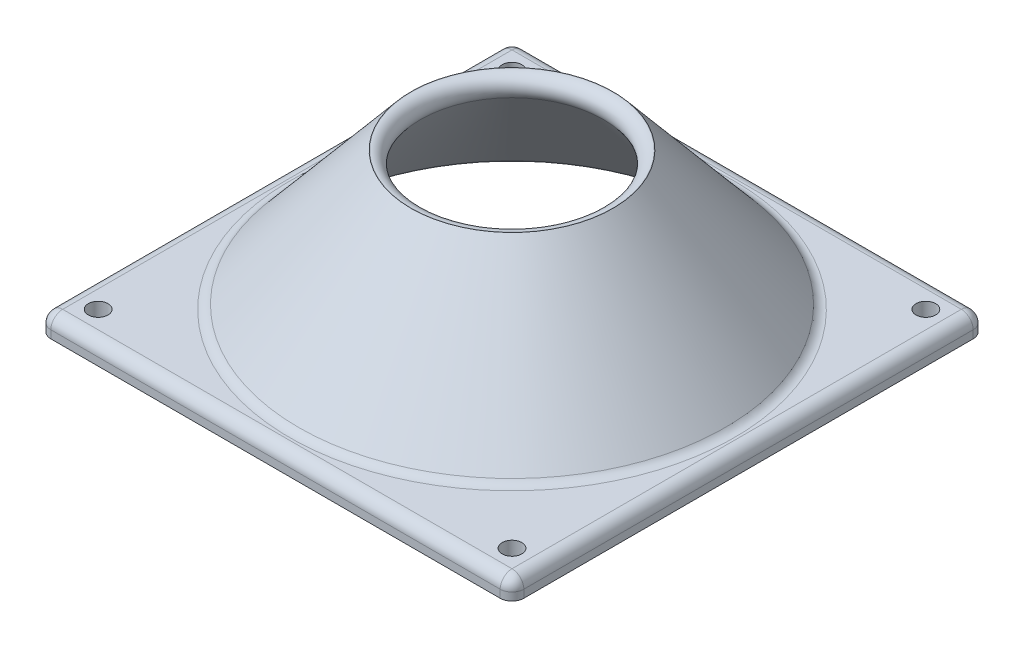
ISO-10303-21;
HEADER;
FILE_DESCRIPTION(('STEP AP214'),'2;1');
FILE_NAME('part.step','',(''),(''),'','','');
FILE_SCHEMA(('AUTOMOTIVE_DESIGN { 1 0 10303 214 1 1 1 1 }'));
ENDSEC;
DATA;
#1=APPLICATION_CONTEXT('core data for automotive mechanical design processes');
#2=APPLICATION_PROTOCOL_DEFINITION('international standard','automotive_design',2000,#1);
#3=PRODUCT_CONTEXT('',#1,'mechanical');
#4=PRODUCT('Part','Part','',(#3));
#5=PRODUCT_RELATED_PRODUCT_CATEGORY('part','',(#4));
#6=PRODUCT_DEFINITION_FORMATION('','',#4);
#7=PRODUCT_DEFINITION_CONTEXT('part definition',#1,'design');
#8=PRODUCT_DEFINITION('design','',#6,#7);
#9=PRODUCT_DEFINITION_SHAPE('','',#8);
#10=(LENGTH_UNIT() NAMED_UNIT(*) SI_UNIT(.MILLI.,.METRE.));
#11=(NAMED_UNIT(*) PLANE_ANGLE_UNIT() SI_UNIT($,.RADIAN.));
#12=(NAMED_UNIT(*) SI_UNIT($,.STERADIAN.) SOLID_ANGLE_UNIT());
#13=UNCERTAINTY_MEASURE_WITH_UNIT(LENGTH_MEASURE(1.E-05),#10,'distance_accuracy_value','');
#14=(GEOMETRIC_REPRESENTATION_CONTEXT(3) GLOBAL_UNCERTAINTY_ASSIGNED_CONTEXT((#13)) GLOBAL_UNIT_ASSIGNED_CONTEXT((#10,
#11,#12)) REPRESENTATION_CONTEXT('',''));
#15=CARTESIAN_POINT('',(0.,0.,0.));
#16=DIRECTION('',(0.,0.,1.));
#17=DIRECTION('',(1.,0.,0.));
#18=AXIS2_PLACEMENT_3D('',#15,#16,#17);
#19=CARTESIAN_POINT('',(0.,5.,0.));
#20=DIRECTION('',(0.,-1.,0.));
#21=DIRECTION('',(0.,0.,-1.));
#22=AXIS2_PLACEMENT_3D('',#19,#20,#21);
#23=PLANE('',#22);
#24=DIRECTION('',(1.,0.,0.));
#25=VECTOR('',#24,1.);
#26=CARTESIAN_POINT('',(0.,5.,57.));
#27=LINE('',#26,#25);
#28=CARTESIAN_POINT('',(-57.,5.,57.));
#29=VERTEX_POINT('',#28);
#30=CARTESIAN_POINT('',(57.,5.,57.));
#31=VERTEX_POINT('',#30);
#32=EDGE_CURVE('E144',#29,#31,#27,.T.);
#33=ORIENTED_EDGE('',*,*,#32,.T.);
#34=DIRECTION('',(0.,0.,-1.));
#35=VECTOR('',#34,1.);
#36=CARTESIAN_POINT('',(57.,5.,0.));
#37=LINE('',#36,#35);
#38=CARTESIAN_POINT('',(57.,5.,-57.));
#39=VERTEX_POINT('',#38);
#40=EDGE_CURVE('E116',#31,#39,#37,.T.);
#41=ORIENTED_EDGE('',*,*,#40,.T.);
#42=DIRECTION('',(-1.,0.,0.));
#43=VECTOR('',#42,1.);
#44=CARTESIAN_POINT('',(0.,5.,-57.));
#45=LINE('',#44,#43);
#46=CARTESIAN_POINT('',(-57.,5.,-57.));
#47=VERTEX_POINT('',#46);
#48=EDGE_CURVE('E133',#39,#47,#45,.T.);
#49=ORIENTED_EDGE('',*,*,#48,.T.);
#50=DIRECTION('',(0.,0.,1.));
#51=VECTOR('',#50,1.);
#52=CARTESIAN_POINT('',(-57.,5.,0.));
#53=LINE('',#52,#51);
#54=EDGE_CURVE('E139',#47,#29,#53,.T.);
#55=ORIENTED_EDGE('',*,*,#54,.T.);
#56=EDGE_LOOP('',(#33,#41,#49,#55));
#57=FACE_BOUND('',#56,.T.);
#58=CARTESIAN_POINT('',(0.,5.,0.));
#59=DIRECTION('',(0.,-1.,0.));
#60=DIRECTION('',(0.,0.,-1.));
#61=AXIS2_PLACEMENT_3D('',#58,#59,#60);
#62=CIRCLE('',#61,56.398922974465);
#63=CARTESIAN_POINT('',(0.,5.,-56.398922974465));
#64=VERTEX_POINT('',#63);
#65=EDGE_CURVE('E249',#64,#64,#62,.T.);
#66=ORIENTED_EDGE('',*,*,#65,.T.);
#67=EDGE_LOOP('',(#66));
#68=FACE_BOUND('',#67,.T.);
#69=CARTESIAN_POINT('',(-52.5,5.,-52.5));
#70=DIRECTION('',(0.,1.,0.));
#71=DIRECTION('',(0.,0.,1.));
#72=AXIS2_PLACEMENT_3D('',#69,#70,#71);
#73=CIRCLE('',#72,2.5);
#74=CARTESIAN_POINT('',(-52.5,5.,-50.));
#75=VERTEX_POINT('',#74);
#76=EDGE_CURVE('E224',#75,#75,#73,.T.);
#77=ORIENTED_EDGE('',*,*,#76,.F.);
#78=EDGE_LOOP('',(#77));
#79=FACE_BOUND('',#78,.T.);
#80=CARTESIAN_POINT('',(52.5,5.,-52.5000000000029));
#81=DIRECTION('',(0.,1.,0.));
#82=DIRECTION('',(0.,0.,1.));
#83=AXIS2_PLACEMENT_3D('',#80,#81,#82);
#84=CIRCLE('',#83,2.50000000000305);
#85=CARTESIAN_POINT('',(52.5,5.,-49.9999999999999));
#86=VERTEX_POINT('',#85);
#87=EDGE_CURVE('E218',#86,#86,#84,.T.);
#88=ORIENTED_EDGE('',*,*,#87,.F.);
#89=EDGE_LOOP('',(#88));
#90=FACE_BOUND('',#89,.T.);
#91=CARTESIAN_POINT('',(52.5000000000029,5.,52.499999999997));
#92=DIRECTION('',(0.,1.,0.));
#93=DIRECTION('',(0.,0.,1.));
#94=AXIS2_PLACEMENT_3D('',#91,#92,#93);
#95=CIRCLE('',#94,2.50000000000414);
#96=CARTESIAN_POINT('',(52.5000000000029,5.,55.0000000000012));
#97=VERTEX_POINT('',#96);
#98=EDGE_CURVE('E212',#97,#97,#95,.T.);
#99=ORIENTED_EDGE('',*,*,#98,.F.);
#100=EDGE_LOOP('',(#99));
#101=FACE_BOUND('',#100,.T.);
#102=CARTESIAN_POINT('',(-52.499999999997,5.,52.5));
#103=DIRECTION('',(0.,1.,0.));
#104=DIRECTION('',(0.,0.,1.));
#105=AXIS2_PLACEMENT_3D('',#102,#103,#104);
#106=CIRCLE('',#105,2.50000000000155);
#107=CARTESIAN_POINT('',(-52.499999999997,5.,55.0000000000015));
#108=VERTEX_POINT('',#107);
#109=EDGE_CURVE('E206',#108,#108,#106,.T.);
#110=ORIENTED_EDGE('',*,*,#109,.F.);
#111=EDGE_LOOP('',(#110));
#112=FACE_BOUND('',#111,.T.);
#113=ADVANCED_FACE('F33',(#57,#68,#79,#90,#101,#112),#23,.F.);
#114=CARTESIAN_POINT('',(0.,0.,0.));
#115=DIRECTION('',(0.,-1.,0.));
#116=DIRECTION('',(0.,0.,-1.));
#117=AXIS2_PLACEMENT_3D('',#114,#115,#116);
#118=PLANE('',#117);
#119=CARTESIAN_POINT('',(0.,0.,0.));
#120=DIRECTION('',(0.,-1.,0.));
#121=DIRECTION('',(0.,0.,-1.));
#122=AXIS2_PLACEMENT_3D('',#119,#120,#121);
#123=CIRCLE('',#122,54.06738468369);
#124=CARTESIAN_POINT('',(0.,0.,-54.06738468369));
#125=VERTEX_POINT('',#124);
#126=EDGE_CURVE('E252',#125,#125,#123,.F.);
#127=ORIENTED_EDGE('',*,*,#126,.T.);
#128=EDGE_LOOP('',(#127));
#129=FACE_BOUND('',#128,.T.);
#130=CARTESIAN_POINT('',(52.5000000000029,0.,52.499999999997));
#131=DIRECTION('',(0.,1.,0.));
#132=DIRECTION('',(0.,0.,1.));
#133=AXIS2_PLACEMENT_3D('',#130,#131,#132);
#134=CIRCLE('',#133,2.50000000000414);
#135=CARTESIAN_POINT('',(52.5000000000029,0.,55.0000000000012));
#136=VERTEX_POINT('',#135);
#137=EDGE_CURVE('E210',#136,#136,#134,.T.);
#138=ORIENTED_EDGE('',*,*,#137,.T.);
#139=EDGE_LOOP('',(#138));
#140=FACE_BOUND('',#139,.T.);
#141=CARTESIAN_POINT('',(-52.5,0.,-52.5));
#142=DIRECTION('',(0.,1.,0.));
#143=DIRECTION('',(0.,0.,1.));
#144=AXIS2_PLACEMENT_3D('',#141,#142,#143);
#145=CIRCLE('',#144,2.5);
#146=CARTESIAN_POINT('',(-52.5,0.,-50.));
#147=VERTEX_POINT('',#146);
#148=EDGE_CURVE('E221',#147,#147,#145,.T.);
#149=ORIENTED_EDGE('',*,*,#148,.T.);
#150=EDGE_LOOP('',(#149));
#151=FACE_BOUND('',#150,.T.);
#152=DIRECTION('',(0.,0.,-1.));
#153=VECTOR('',#152,1.);
#154=CARTESIAN_POINT('',(60.,0.,60.));
#155=LINE('',#154,#153);
#156=CARTESIAN_POINT('',(60.,0.,57.));
#157=VERTEX_POINT('',#156);
#158=CARTESIAN_POINT('',(60.,0.,-57.));
#159=VERTEX_POINT('',#158);
#160=EDGE_CURVE('E227',#157,#159,#155,.T.);
#161=ORIENTED_EDGE('',*,*,#160,.F.);
#162=CARTESIAN_POINT('',(57.,0.,57.));
#163=DIRECTION('',(0.,-1.,0.));
#164=DIRECTION('',(0.,0.,-1.));
#165=AXIS2_PLACEMENT_3D('',#162,#163,#164);
#166=CIRCLE('',#165,3.);
#167=CARTESIAN_POINT('',(57.,0.,60.));
#168=VERTEX_POINT('',#167);
#169=EDGE_CURVE('E11',#157,#168,#166,.T.);
#170=ORIENTED_EDGE('',*,*,#169,.T.);
#171=DIRECTION('',(1.,0.,0.));
#172=VECTOR('',#171,1.);
#173=CARTESIAN_POINT('',(-60.,0.,60.));
#174=LINE('',#173,#172);
#175=CARTESIAN_POINT('',(-57.,0.,60.));
#176=VERTEX_POINT('',#175);
#177=EDGE_CURVE('E237',#176,#168,#174,.T.);
#178=ORIENTED_EDGE('',*,*,#177,.F.);
#179=CARTESIAN_POINT('',(-57.,0.,57.));
#180=DIRECTION('',(0.,-1.,0.));
#181=DIRECTION('',(0.,0.,-1.));
#182=AXIS2_PLACEMENT_3D('',#179,#180,#181);
#183=CIRCLE('',#182,3.);
#184=CARTESIAN_POINT('',(-60.,0.,57.));
#185=VERTEX_POINT('',#184);
#186=EDGE_CURVE('E171',#176,#185,#183,.T.);
#187=ORIENTED_EDGE('',*,*,#186,.T.);
#188=DIRECTION('',(0.,0.,1.));
#189=VECTOR('',#188,1.);
#190=CARTESIAN_POINT('',(-60.,0.,60.));
#191=LINE('',#190,#189);
#192=CARTESIAN_POINT('',(-60.,0.,-57.));
#193=VERTEX_POINT('',#192);
#194=EDGE_CURVE('E234',#193,#185,#191,.T.);
#195=ORIENTED_EDGE('',*,*,#194,.F.);
#196=CARTESIAN_POINT('',(-57.,0.,-57.));
#197=DIRECTION('',(0.,-1.,0.));
#198=DIRECTION('',(0.,0.,-1.));
#199=AXIS2_PLACEMENT_3D('',#196,#197,#198);
#200=CIRCLE('',#199,3.);
#201=CARTESIAN_POINT('',(-57.,0.,-60.));
#202=VERTEX_POINT('',#201);
#203=EDGE_CURVE('E173',#193,#202,#200,.T.);
#204=ORIENTED_EDGE('',*,*,#203,.T.);
#205=DIRECTION('',(-1.,0.,0.));
#206=VECTOR('',#205,1.);
#207=CARTESIAN_POINT('',(-60.,0.,-60.));
#208=LINE('',#207,#206);
#209=CARTESIAN_POINT('',(57.,0.,-60.));
#210=VERTEX_POINT('',#209);
#211=EDGE_CURVE('E232',#210,#202,#208,.T.);
#212=ORIENTED_EDGE('',*,*,#211,.F.);
#213=CARTESIAN_POINT('',(57.,0.,-57.));
#214=DIRECTION('',(0.,-1.,0.));
#215=DIRECTION('',(0.,0.,-1.));
#216=AXIS2_PLACEMENT_3D('',#213,#214,#215);
#217=CIRCLE('',#216,3.);
#218=EDGE_CURVE('E42',#210,#159,#217,.T.);
#219=ORIENTED_EDGE('',*,*,#218,.T.);
#220=EDGE_LOOP('',(#161,#170,#178,#187,#195,#204,#212,#219));
#221=FACE_BOUND('',#220,.T.);
#222=CARTESIAN_POINT('',(52.5,0.,-52.5000000000029));
#223=DIRECTION('',(0.,1.,0.));
#224=DIRECTION('',(0.,0.,1.));
#225=AXIS2_PLACEMENT_3D('',#222,#223,#224);
#226=CIRCLE('',#225,2.50000000000305);
#227=CARTESIAN_POINT('',(52.5,0.,-49.9999999999999));
#228=VERTEX_POINT('',#227);
#229=EDGE_CURVE('E215',#228,#228,#226,.T.);
#230=ORIENTED_EDGE('',*,*,#229,.T.);
#231=EDGE_LOOP('',(#230));
#232=FACE_BOUND('',#231,.T.);
#233=CARTESIAN_POINT('',(-52.499999999997,0.,52.5));
#234=DIRECTION('',(0.,1.,0.));
#235=DIRECTION('',(0.,0.,1.));
#236=AXIS2_PLACEMENT_3D('',#233,#234,#235);
#237=CIRCLE('',#236,2.50000000000155);
#238=CARTESIAN_POINT('',(-52.499999999997,0.,55.0000000000015));
#239=VERTEX_POINT('',#238);
#240=EDGE_CURVE('E201',#239,#239,#237,.T.);
#241=ORIENTED_EDGE('',*,*,#240,.T.);
#242=EDGE_LOOP('',(#241));
#243=FACE_BOUND('',#242,.T.);
#244=ADVANCED_FACE('F283',(#129,#140,#151,#221,#232,#243),#118,.T.);
#245=CARTESIAN_POINT('',(60.,5.,60.));
#246=DIRECTION('',(-1.,0.,0.));
#247=DIRECTION('',(0.,0.,1.));
#248=AXIS2_PLACEMENT_3D('',#245,#246,#247);
#249=PLANE('',#248);
#250=DIRECTION('',(0.,0.,-1.));
#251=VECTOR('',#250,1.);
#252=CARTESIAN_POINT('',(60.,2.,60.));
#253=LINE('',#252,#251);
#254=CARTESIAN_POINT('',(60.,2.,-57.));
#255=VERTEX_POINT('',#254);
#256=CARTESIAN_POINT('',(60.,2.,57.));
#257=VERTEX_POINT('',#256);
#258=EDGE_CURVE('E118',#255,#257,#253,.F.);
#259=ORIENTED_EDGE('',*,*,#258,.T.);
#260=DIRECTION('',(0.,-1.,0.));
#261=VECTOR('',#260,1.);
#262=CARTESIAN_POINT('',(60.,5.,57.));
#263=LINE('',#262,#261);
#264=EDGE_CURVE('E153',#257,#157,#263,.T.);
#265=ORIENTED_EDGE('',*,*,#264,.T.);
#266=ORIENTED_EDGE('',*,*,#160,.T.);
#267=DIRECTION('',(0.,-1.,0.));
#268=VECTOR('',#267,1.);
#269=CARTESIAN_POINT('',(60.,5.,-57.));
#270=LINE('',#269,#268);
#271=EDGE_CURVE('E146',#159,#255,#270,.F.);
#272=ORIENTED_EDGE('',*,*,#271,.T.);
#273=EDGE_LOOP('',(#259,#265,#266,#272));
#274=FACE_BOUND('',#273,.T.);
#275=ADVANCED_FACE('F275',(#274),#249,.F.);
#276=CARTESIAN_POINT('',(-60.,5.,-60.));
#277=DIRECTION('',(0.,0.,1.));
#278=DIRECTION('',(1.,0.,0.));
#279=AXIS2_PLACEMENT_3D('',#276,#277,#278);
#280=PLANE('',#279);
#281=DIRECTION('',(-1.,0.,0.));
#282=VECTOR('',#281,1.);
#283=CARTESIAN_POINT('',(-60.,2.,-60.));
#284=LINE('',#283,#282);
#285=CARTESIAN_POINT('',(-57.,2.,-60.));
#286=VERTEX_POINT('',#285);
#287=CARTESIAN_POINT('',(57.,2.,-60.));
#288=VERTEX_POINT('',#287);
#289=EDGE_CURVE('E50',#286,#288,#284,.F.);
#290=ORIENTED_EDGE('',*,*,#289,.T.);
#291=DIRECTION('',(0.,-1.,0.));
#292=VECTOR('',#291,1.);
#293=CARTESIAN_POINT('',(57.,5.,-60.));
#294=LINE('',#293,#292);
#295=EDGE_CURVE('E169',#288,#210,#294,.T.);
#296=ORIENTED_EDGE('',*,*,#295,.T.);
#297=ORIENTED_EDGE('',*,*,#211,.T.);
#298=DIRECTION('',(0.,-1.,0.));
#299=VECTOR('',#298,1.);
#300=CARTESIAN_POINT('',(-57.,5.,-60.));
#301=LINE('',#300,#299);
#302=EDGE_CURVE('E55',#202,#286,#301,.F.);
#303=ORIENTED_EDGE('',*,*,#302,.T.);
#304=EDGE_LOOP('',(#290,#296,#297,#303));
#305=FACE_BOUND('',#304,.T.);
#306=ADVANCED_FACE('F281',(#305),#280,.F.);
#307=CARTESIAN_POINT('',(-60.,5.,60.));
#308=DIRECTION('',(1.,0.,0.));
#309=DIRECTION('',(0.,0.,-1.));
#310=AXIS2_PLACEMENT_3D('',#307,#308,#309);
#311=PLANE('',#310);
#312=DIRECTION('',(0.,0.,1.));
#313=VECTOR('',#312,1.);
#314=CARTESIAN_POINT('',(-60.,2.,60.));
#315=LINE('',#314,#313);
#316=CARTESIAN_POINT('',(-60.,2.,57.));
#317=VERTEX_POINT('',#316);
#318=CARTESIAN_POINT('',(-60.,2.,-57.));
#319=VERTEX_POINT('',#318);
#320=EDGE_CURVE('E163',#317,#319,#315,.F.);
#321=ORIENTED_EDGE('',*,*,#320,.T.);
#322=DIRECTION('',(0.,-1.,0.));
#323=VECTOR('',#322,1.);
#324=CARTESIAN_POINT('',(-60.,5.,-57.));
#325=LINE('',#324,#323);
#326=EDGE_CURVE('E165',#319,#193,#325,.T.);
#327=ORIENTED_EDGE('',*,*,#326,.T.);
#328=ORIENTED_EDGE('',*,*,#194,.T.);
#329=DIRECTION('',(0.,-1.,0.));
#330=VECTOR('',#329,1.);
#331=CARTESIAN_POINT('',(-60.,5.,57.));
#332=LINE('',#331,#330);
#333=EDGE_CURVE('E161',#185,#317,#332,.F.);
#334=ORIENTED_EDGE('',*,*,#333,.T.);
#335=EDGE_LOOP('',(#321,#327,#328,#334));
#336=FACE_BOUND('',#335,.T.);
#337=ADVANCED_FACE('F314',(#336),#311,.F.);
#338=CARTESIAN_POINT('',(-60.,5.,60.));
#339=DIRECTION('',(0.,0.,-1.));
#340=DIRECTION('',(-1.,0.,0.));
#341=AXIS2_PLACEMENT_3D('',#338,#339,#340);
#342=PLANE('',#341);
#343=ORIENTED_EDGE('',*,*,#177,.T.);
#344=DIRECTION('',(0.,-1.,0.));
#345=VECTOR('',#344,1.);
#346=CARTESIAN_POINT('',(57.,5.,60.));
#347=LINE('',#346,#345);
#348=CARTESIAN_POINT('',(57.,2.,60.));
#349=VERTEX_POINT('',#348);
#350=EDGE_CURVE('E159',#168,#349,#347,.F.);
#351=ORIENTED_EDGE('',*,*,#350,.T.);
#352=DIRECTION('',(1.,0.,0.));
#353=VECTOR('',#352,1.);
#354=CARTESIAN_POINT('',(-60.,2.,60.));
#355=LINE('',#354,#353);
#356=CARTESIAN_POINT('',(-57.,2.,60.));
#357=VERTEX_POINT('',#356);
#358=EDGE_CURVE('E157',#349,#357,#355,.F.);
#359=ORIENTED_EDGE('',*,*,#358,.T.);
#360=DIRECTION('',(0.,-1.,0.));
#361=VECTOR('',#360,1.);
#362=CARTESIAN_POINT('',(-57.,5.,60.));
#363=LINE('',#362,#361);
#364=EDGE_CURVE('E155',#357,#176,#363,.T.);
#365=ORIENTED_EDGE('',*,*,#364,.T.);
#366=EDGE_LOOP('',(#343,#351,#359,#365));
#367=FACE_BOUND('',#366,.T.);
#368=ADVANCED_FACE('F311',(#367),#342,.F.);
#369=CARTESIAN_POINT('',(-52.5,5.,-52.5));
#370=DIRECTION('',(0.,-1.,0.));
#371=DIRECTION('',(0.,0.,-1.));
#372=AXIS2_PLACEMENT_3D('',#369,#370,#371);
#373=CYLINDRICAL_SURFACE('',#372,2.5);
#374=ORIENTED_EDGE('',*,*,#76,.T.);
#375=EDGE_LOOP('',(#374));
#376=FACE_BOUND('',#375,.T.);
#377=ORIENTED_EDGE('',*,*,#148,.F.);
#378=EDGE_LOOP('',(#377));
#379=FACE_BOUND('',#378,.T.);
#380=ADVANCED_FACE('F308',(#376,#379),#373,.F.);
#381=CARTESIAN_POINT('',(52.5,5.,-52.5000000000029));
#382=DIRECTION('',(0.,-1.,0.));
#383=DIRECTION('',(0.,0.,-1.));
#384=AXIS2_PLACEMENT_3D('',#381,#382,#383);
#385=CYLINDRICAL_SURFACE('',#384,2.50000000000305);
#386=ORIENTED_EDGE('',*,*,#87,.T.);
#387=EDGE_LOOP('',(#386));
#388=FACE_BOUND('',#387,.T.);
#389=ORIENTED_EDGE('',*,*,#229,.F.);
#390=EDGE_LOOP('',(#389));
#391=FACE_BOUND('',#390,.T.);
#392=ADVANCED_FACE('F476',(#388,#391),#385,.F.);
#393=CARTESIAN_POINT('',(52.5000000000029,5.,52.499999999997));
#394=DIRECTION('',(0.,-1.,0.));
#395=DIRECTION('',(0.,0.,-1.));
#396=AXIS2_PLACEMENT_3D('',#393,#394,#395);
#397=CYLINDRICAL_SURFACE('',#396,2.50000000000414);
#398=ORIENTED_EDGE('',*,*,#98,.T.);
#399=EDGE_LOOP('',(#398));
#400=FACE_BOUND('',#399,.T.);
#401=ORIENTED_EDGE('',*,*,#137,.F.);
#402=EDGE_LOOP('',(#401));
#403=FACE_BOUND('',#402,.T.);
#404=ADVANCED_FACE('F467',(#400,#403),#397,.F.);
#405=CARTESIAN_POINT('',(-52.499999999997,5.,52.5));
#406=DIRECTION('',(0.,-1.,0.));
#407=DIRECTION('',(0.,0.,-1.));
#408=AXIS2_PLACEMENT_3D('',#405,#406,#407);
#409=CYLINDRICAL_SURFACE('',#408,2.50000000000155);
#410=ORIENTED_EDGE('',*,*,#109,.T.);
#411=EDGE_LOOP('',(#410));
#412=FACE_BOUND('',#411,.T.);
#413=ORIENTED_EDGE('',*,*,#240,.F.);
#414=EDGE_LOOP('',(#413));
#415=FACE_BOUND('',#414,.T.);
#416=ADVANCED_FACE('F458',(#412,#415),#409,.F.);
#417=CARTESIAN_POINT('',(0.,5.,0.));
#418=DIRECTION('',(0.,-1.,0.));
#419=DIRECTION('',(0.,0.,1.));
#420=AXIS2_PLACEMENT_3D('',#417,#418,#419);
#421=CONICAL_SURFACE('',#420,55.,0.698131700797733);
#422=CARTESIAN_POINT('',(0.,6.07163717094038,0.));
#423=DIRECTION('',(0.,-1.,0.));
#424=DIRECTION('',(0.,0.,-1.));
#425=AXIS2_PLACEMENT_3D('',#422,#423,#424);
#426=CIRCLE('',#425,54.1007896451081);
#427=CARTESIAN_POINT('',(0.,6.07163717094038,-54.1007896451081));
#428=VERTEX_POINT('',#427);
#429=EDGE_CURVE('E246',#428,#428,#426,.F.);
#430=ORIENTED_EDGE('',*,*,#429,.T.);
#431=EDGE_LOOP('',(#430));
#432=FACE_BOUND('',#431,.T.);
#433=CARTESIAN_POINT('',(0.,40.,0.));
#434=DIRECTION('',(0.,1.,0.));
#435=DIRECTION('',(0.,0.,1.));
#436=AXIS2_PLACEMENT_3D('',#433,#434,#435);
#437=CIRCLE('',#436,25.6315129087951);
#438=CARTESIAN_POINT('',(0.,40.,25.6315129087951));
#439=VERTEX_POINT('',#438);
#440=EDGE_CURVE('E198',#439,#439,#437,.T.);
#441=ORIENTED_EDGE('',*,*,#440,.F.);
#442=EDGE_LOOP('',(#441));
#443=FACE_BOUND('',#442,.T.);
#444=ADVANCED_FACE('F449',(#432,#443),#421,.T.);
#445=CARTESIAN_POINT('',(0.,40.,0.));
#446=DIRECTION('',(0.,1.,0.));
#447=DIRECTION('',(0.,0.,1.));
#448=AXIS2_PLACEMENT_3D('',#445,#446,#447);
#449=PLANE('',#448);
#450=CARTESIAN_POINT('',(0.,40.,0.));
#451=DIRECTION('',(0.,1.,0.));
#452=DIRECTION('',(0.,0.,1.));
#453=AXIS2_PLACEMENT_3D('',#450,#451,#452);
#454=CIRCLE('',#453,25.5379972236624);
#455=CARTESIAN_POINT('',(0.,40.,25.5379972236624));
#456=VERTEX_POINT('',#455);
#457=EDGE_CURVE('E243',#456,#456,#454,.F.);
#458=ORIENTED_EDGE('',*,*,#457,.T.);
#459=EDGE_LOOP('',(#458));
#460=FACE_BOUND('',#459,.T.);
#461=ORIENTED_EDGE('',*,*,#440,.T.);
#462=EDGE_LOOP('',(#461));
#463=FACE_BOUND('',#462,.T.);
#464=ADVANCED_FACE('F441',(#460,#463),#449,.T.);
#465=CARTESIAN_POINT('',(0.,1.7860619515673,0.));
#466=DIRECTION('',(0.,-1.,0.));
#467=DIRECTION('',(0.,0.,1.));
#468=AXIS2_PLACEMENT_3D('',#465,#466,#467);
#469=CONICAL_SURFACE('',#468,51.1697777844051,0.698131700797733);
#470=CARTESIAN_POINT('',(0.,1.07163717094038,0.));
#471=DIRECTION('',(0.,1.,0.));
#472=DIRECTION('',(0.,0.,1.));
#473=AXIS2_PLACEMENT_3D('',#470,#471,#472);
#474=CIRCLE('',#473,51.7692513543331);
#475=CARTESIAN_POINT('',(0.,1.07163717094038,51.7692513543331));
#476=VERTEX_POINT('',#475);
#477=EDGE_CURVE('E140',#476,#476,#474,.F.);
#478=ORIENTED_EDGE('',*,*,#477,.T.);
#479=EDGE_LOOP('',(#478));
#480=FACE_BOUND('',#479,.T.);
#481=CARTESIAN_POINT('',(0.,35.0716371709404,0.));
#482=DIRECTION('',(0.,1.,0.));
#483=DIRECTION('',(0.,0.,1.));
#484=AXIS2_PLACEMENT_3D('',#481,#482,#483);
#485=CIRCLE('',#484,23.2398638943055);
#486=CARTESIAN_POINT('',(0.,35.0716371709404,23.2398638943055));
#487=VERTEX_POINT('',#486);
#488=EDGE_CURVE('E240',#487,#487,#485,.T.);
#489=ORIENTED_EDGE('',*,*,#488,.T.);
#490=EDGE_LOOP('',(#489));
#491=FACE_BOUND('',#490,.T.);
#492=ADVANCED_FACE('F327',(#480,#491),#469,.F.);
#493=CARTESIAN_POINT('',(0.,37.,0.));
#494=DIRECTION('',(0.,1.,0.));
#495=DIRECTION('',(0.,0.,1.));
#496=AXIS2_PLACEMENT_3D('',#493,#494,#495);
#497=TOROIDAL_SURFACE('',#496,25.5379972236624,3.);
#498=ORIENTED_EDGE('',*,*,#457,.F.);
#499=EDGE_LOOP('',(#498));
#500=FACE_BOUND('',#499,.T.);
#501=ORIENTED_EDGE('',*,*,#488,.F.);
#502=EDGE_LOOP('',(#501));
#503=FACE_BOUND('',#502,.T.);
#504=ADVANCED_FACE('F323',(#500,#503),#497,.T.);
#505=CARTESIAN_POINT('',(0.,8.,0.));
#506=DIRECTION('',(0.,-1.,0.));
#507=DIRECTION('',(0.,0.,-1.));
#508=AXIS2_PLACEMENT_3D('',#505,#506,#507);
#509=TOROIDAL_SURFACE('',#508,56.398922974465,3.);
#510=ORIENTED_EDGE('',*,*,#65,.F.);
#511=EDGE_LOOP('',(#510));
#512=FACE_BOUND('',#511,.T.);
#513=ORIENTED_EDGE('',*,*,#429,.F.);
#514=EDGE_LOOP('',(#513));
#515=FACE_BOUND('',#514,.T.);
#516=ADVANCED_FACE('F326',(#512,#515),#509,.F.);
#517=CARTESIAN_POINT('',(0.,3.,0.));
#518=DIRECTION('',(0.,-1.,0.));
#519=DIRECTION('',(0.,0.,-1.));
#520=AXIS2_PLACEMENT_3D('',#517,#518,#519);
#521=TOROIDAL_SURFACE('',#520,54.06738468369,3.);
#522=ORIENTED_EDGE('',*,*,#477,.F.);
#523=EDGE_LOOP('',(#522));
#524=FACE_BOUND('',#523,.T.);
#525=ORIENTED_EDGE('',*,*,#126,.F.);
#526=EDGE_LOOP('',(#525));
#527=FACE_BOUND('',#526,.T.);
#528=ADVANCED_FACE('F331',(#524,#527),#521,.T.);
#529=CARTESIAN_POINT('',(-57.,5.,57.));
#530=DIRECTION('',(0.,-1.,0.));
#531=DIRECTION('',(0.,0.,-1.));
#532=AXIS2_PLACEMENT_3D('',#529,#530,#531);
#533=CYLINDRICAL_SURFACE('',#532,3.);
#534=ORIENTED_EDGE('',*,*,#186,.F.);
#535=ORIENTED_EDGE('',*,*,#364,.F.);
#536=CARTESIAN_POINT('',(-57.,2.,57.));
#537=DIRECTION('',(0.,1.,0.));
#538=DIRECTION('',(0.,0.,1.));
#539=AXIS2_PLACEMENT_3D('',#536,#537,#538);
#540=CIRCLE('',#539,3.);
#541=EDGE_CURVE('E37',#317,#357,#540,.T.);
#542=ORIENTED_EDGE('',*,*,#541,.F.);
#543=ORIENTED_EDGE('',*,*,#333,.F.);
#544=EDGE_LOOP('',(#534,#535,#542,#543));
#545=FACE_BOUND('',#544,.T.);
#546=ADVANCED_FACE('F35',(#545),#533,.T.);
#547=CARTESIAN_POINT('',(-57.,2.,0.));
#548=DIRECTION('',(0.,0.,1.));
#549=DIRECTION('',(1.,0.,0.));
#550=AXIS2_PLACEMENT_3D('',#547,#548,#549);
#551=CYLINDRICAL_SURFACE('',#550,3.);
#552=CARTESIAN_POINT('',(-57.,2.,-57.));
#553=DIRECTION('',(0.,0.,-1.));
#554=DIRECTION('',(-1.,0.,0.));
#555=AXIS2_PLACEMENT_3D('',#552,#553,#554);
#556=CIRCLE('',#555,3.);
#557=EDGE_CURVE('E190',#319,#47,#556,.T.);
#558=ORIENTED_EDGE('',*,*,#557,.F.);
#559=ORIENTED_EDGE('',*,*,#320,.F.);
#560=CARTESIAN_POINT('',(-57.,2.,57.));
#561=DIRECTION('',(0.,0.,1.));
#562=DIRECTION('',(1.,0.,0.));
#563=AXIS2_PLACEMENT_3D('',#560,#561,#562);
#564=CIRCLE('',#563,3.);
#565=EDGE_CURVE('E192',#29,#317,#564,.T.);
#566=ORIENTED_EDGE('',*,*,#565,.F.);
#567=ORIENTED_EDGE('',*,*,#54,.F.);
#568=EDGE_LOOP('',(#558,#559,#566,#567));
#569=FACE_BOUND('',#568,.T.);
#570=ADVANCED_FACE('F259',(#569),#551,.T.);
#571=CARTESIAN_POINT('',(-57.,5.,-57.));
#572=DIRECTION('',(0.,-1.,0.));
#573=DIRECTION('',(0.,0.,-1.));
#574=AXIS2_PLACEMENT_3D('',#571,#572,#573);
#575=CYLINDRICAL_SURFACE('',#574,3.);
#576=ORIENTED_EDGE('',*,*,#203,.F.);
#577=ORIENTED_EDGE('',*,*,#326,.F.);
#578=CARTESIAN_POINT('',(-57.,2.,-57.));
#579=DIRECTION('',(0.,1.,0.));
#580=DIRECTION('',(0.,0.,1.));
#581=AXIS2_PLACEMENT_3D('',#578,#579,#580);
#582=CIRCLE('',#581,3.);
#583=EDGE_CURVE('E187',#286,#319,#582,.T.);
#584=ORIENTED_EDGE('',*,*,#583,.F.);
#585=ORIENTED_EDGE('',*,*,#302,.F.);
#586=EDGE_LOOP('',(#576,#577,#584,#585));
#587=FACE_BOUND('',#586,.T.);
#588=ADVANCED_FACE('F289',(#587),#575,.T.);
#589=CARTESIAN_POINT('',(-57.,2.,57.));
#590=DIRECTION('',(0.,0.,1.));
#591=DIRECTION('',(1.,0.,0.));
#592=AXIS2_PLACEMENT_3D('',#589,#590,#591);
#593=SPHERICAL_SURFACE('',#592,3.);
#594=ORIENTED_EDGE('',*,*,#565,.T.);
#595=ORIENTED_EDGE('',*,*,#541,.T.);
#596=CARTESIAN_POINT('',(-57.,2.,57.));
#597=DIRECTION('',(-1.,0.,0.));
#598=DIRECTION('',(0.,0.,1.));
#599=AXIS2_PLACEMENT_3D('',#596,#597,#598);
#600=CIRCLE('',#599,3.);
#601=EDGE_CURVE('E184',#29,#357,#600,.F.);
#602=ORIENTED_EDGE('',*,*,#601,.F.);
#603=EDGE_LOOP('',(#594,#595,#602));
#604=FACE_BOUND('',#603,.T.);
#605=ADVANCED_FACE('F260',(#604),#593,.T.);
#606=CARTESIAN_POINT('',(-57.,2.,-57.));
#607=DIRECTION('',(0.,0.,1.));
#608=DIRECTION('',(1.,0.,0.));
#609=AXIS2_PLACEMENT_3D('',#606,#607,#608);
#610=SPHERICAL_SURFACE('',#609,3.);
#611=ORIENTED_EDGE('',*,*,#583,.T.);
#612=ORIENTED_EDGE('',*,*,#557,.T.);
#613=CARTESIAN_POINT('',(-57.,2.,-57.));
#614=DIRECTION('',(-1.,0.,0.));
#615=DIRECTION('',(0.,0.,1.));
#616=AXIS2_PLACEMENT_3D('',#613,#614,#615);
#617=CIRCLE('',#616,3.);
#618=EDGE_CURVE('E136',#286,#47,#617,.F.);
#619=ORIENTED_EDGE('',*,*,#618,.F.);
#620=EDGE_LOOP('',(#611,#612,#619));
#621=FACE_BOUND('',#620,.T.);
#622=ADVANCED_FACE('F291',(#621),#610,.T.);
#623=CARTESIAN_POINT('',(57.,5.,57.));
#624=DIRECTION('',(0.,-1.,0.));
#625=DIRECTION('',(0.,0.,-1.));
#626=AXIS2_PLACEMENT_3D('',#623,#624,#625);
#627=CYLINDRICAL_SURFACE('',#626,3.);
#628=ORIENTED_EDGE('',*,*,#169,.F.);
#629=ORIENTED_EDGE('',*,*,#264,.F.);
#630=CARTESIAN_POINT('',(57.,2.,57.));
#631=DIRECTION('',(0.,1.,0.));
#632=DIRECTION('',(0.,0.,1.));
#633=AXIS2_PLACEMENT_3D('',#630,#631,#632);
#634=CIRCLE('',#633,3.);
#635=EDGE_CURVE('E180',#349,#257,#634,.T.);
#636=ORIENTED_EDGE('',*,*,#635,.F.);
#637=ORIENTED_EDGE('',*,*,#350,.F.);
#638=EDGE_LOOP('',(#628,#629,#636,#637));
#639=FACE_BOUND('',#638,.T.);
#640=ADVANCED_FACE('F272',(#639),#627,.T.);
#641=CARTESIAN_POINT('',(0.,2.,57.));
#642=DIRECTION('',(1.,0.,0.));
#643=DIRECTION('',(0.,0.,-1.));
#644=AXIS2_PLACEMENT_3D('',#641,#642,#643);
#645=CYLINDRICAL_SURFACE('',#644,3.);
#646=ORIENTED_EDGE('',*,*,#601,.T.);
#647=ORIENTED_EDGE('',*,*,#358,.F.);
#648=CARTESIAN_POINT('',(57.,2.,57.));
#649=DIRECTION('',(1.,0.,0.));
#650=DIRECTION('',(0.,0.,-1.));
#651=AXIS2_PLACEMENT_3D('',#648,#649,#650);
#652=CIRCLE('',#651,3.);
#653=EDGE_CURVE('E130',#31,#349,#652,.T.);
#654=ORIENTED_EDGE('',*,*,#653,.F.);
#655=ORIENTED_EDGE('',*,*,#32,.F.);
#656=EDGE_LOOP('',(#646,#647,#654,#655));
#657=FACE_BOUND('',#656,.T.);
#658=ADVANCED_FACE('F263',(#657),#645,.T.);
#659=CARTESIAN_POINT('',(0.,2.,-57.));
#660=DIRECTION('',(-1.,0.,0.));
#661=DIRECTION('',(0.,0.,1.));
#662=AXIS2_PLACEMENT_3D('',#659,#660,#661);
#663=CYLINDRICAL_SURFACE('',#662,3.);
#664=ORIENTED_EDGE('',*,*,#618,.T.);
#665=ORIENTED_EDGE('',*,*,#48,.F.);
#666=CARTESIAN_POINT('',(57.,2.,-57.));
#667=DIRECTION('',(1.,0.,0.));
#668=DIRECTION('',(0.,0.,-1.));
#669=AXIS2_PLACEMENT_3D('',#666,#667,#668);
#670=CIRCLE('',#669,3.);
#671=EDGE_CURVE('E124',#288,#39,#670,.T.);
#672=ORIENTED_EDGE('',*,*,#671,.F.);
#673=ORIENTED_EDGE('',*,*,#289,.F.);
#674=EDGE_LOOP('',(#664,#665,#672,#673));
#675=FACE_BOUND('',#674,.T.);
#676=ADVANCED_FACE('F134',(#675),#663,.T.);
#677=CARTESIAN_POINT('',(57.,5.,-57.));
#678=DIRECTION('',(0.,-1.,0.));
#679=DIRECTION('',(0.,0.,-1.));
#680=AXIS2_PLACEMENT_3D('',#677,#678,#679);
#681=CYLINDRICAL_SURFACE('',#680,3.);
#682=ORIENTED_EDGE('',*,*,#218,.F.);
#683=ORIENTED_EDGE('',*,*,#295,.F.);
#684=CARTESIAN_POINT('',(57.,2.,-57.));
#685=DIRECTION('',(0.,1.,0.));
#686=DIRECTION('',(0.,0.,1.));
#687=AXIS2_PLACEMENT_3D('',#684,#685,#686);
#688=CIRCLE('',#687,3.);
#689=EDGE_CURVE('E128',#255,#288,#688,.T.);
#690=ORIENTED_EDGE('',*,*,#689,.F.);
#691=ORIENTED_EDGE('',*,*,#271,.F.);
#692=EDGE_LOOP('',(#682,#683,#690,#691));
#693=FACE_BOUND('',#692,.T.);
#694=ADVANCED_FACE('F279',(#693),#681,.T.);
#695=CARTESIAN_POINT('',(57.,2.,57.));
#696=DIRECTION('',(0.,0.,1.));
#697=DIRECTION('',(1.,0.,0.));
#698=AXIS2_PLACEMENT_3D('',#695,#696,#697);
#699=SPHERICAL_SURFACE('',#698,3.);
#700=ORIENTED_EDGE('',*,*,#653,.T.);
#701=ORIENTED_EDGE('',*,*,#635,.T.);
#702=CARTESIAN_POINT('',(57.,2.,57.));
#703=DIRECTION('',(0.,0.,1.));
#704=DIRECTION('',(1.,0.,0.));
#705=AXIS2_PLACEMENT_3D('',#702,#703,#704);
#706=CIRCLE('',#705,3.);
#707=EDGE_CURVE('E121',#31,#257,#706,.F.);
#708=ORIENTED_EDGE('',*,*,#707,.F.);
#709=EDGE_LOOP('',(#700,#701,#708));
#710=FACE_BOUND('',#709,.T.);
#711=ADVANCED_FACE('F267',(#710),#699,.T.);
#712=CARTESIAN_POINT('',(57.,2.,-57.));
#713=DIRECTION('',(0.,0.,1.));
#714=DIRECTION('',(1.,0.,0.));
#715=AXIS2_PLACEMENT_3D('',#712,#713,#714);
#716=SPHERICAL_SURFACE('',#715,3.);
#717=ORIENTED_EDGE('',*,*,#689,.T.);
#718=ORIENTED_EDGE('',*,*,#671,.T.);
#719=CARTESIAN_POINT('',(57.,2.,-57.));
#720=DIRECTION('',(0.,0.,-1.));
#721=DIRECTION('',(-1.,0.,0.));
#722=AXIS2_PLACEMENT_3D('',#719,#720,#721);
#723=CIRCLE('',#722,3.);
#724=EDGE_CURVE('E112',#255,#39,#723,.F.);
#725=ORIENTED_EDGE('',*,*,#724,.F.);
#726=EDGE_LOOP('',(#717,#718,#725));
#727=FACE_BOUND('',#726,.T.);
#728=ADVANCED_FACE('F126',(#727),#716,.T.);
#729=CARTESIAN_POINT('',(57.,2.,0.));
#730=DIRECTION('',(0.,0.,-1.));
#731=DIRECTION('',(-1.,0.,0.));
#732=AXIS2_PLACEMENT_3D('',#729,#730,#731);
#733=CYLINDRICAL_SURFACE('',#732,3.);
#734=ORIENTED_EDGE('',*,*,#707,.T.);
#735=ORIENTED_EDGE('',*,*,#258,.F.);
#736=ORIENTED_EDGE('',*,*,#724,.T.);
#737=ORIENTED_EDGE('',*,*,#40,.F.);
#738=EDGE_LOOP('',(#734,#735,#736,#737));
#739=FACE_BOUND('',#738,.T.);
#740=ADVANCED_FACE('F114',(#739),#733,.T.);
#741=CLOSED_SHELL('',(#113,#244,#275,#306,#337,#368,#380,#392,#404,#416,#444,#464,#492,#504,
#516,#528,#546,#570,#588,#605,#622,#640,#658,#676,#694,#711,#728,#740));
#742=MANIFOLD_SOLID_BREP('B2',#741);
#743=ADVANCED_BREP_SHAPE_REPRESENTATION('',(#18,#742),#14);
#744=SHAPE_DEFINITION_REPRESENTATION(#9,#743);
ENDSEC;
END-ISO-10303-21;
